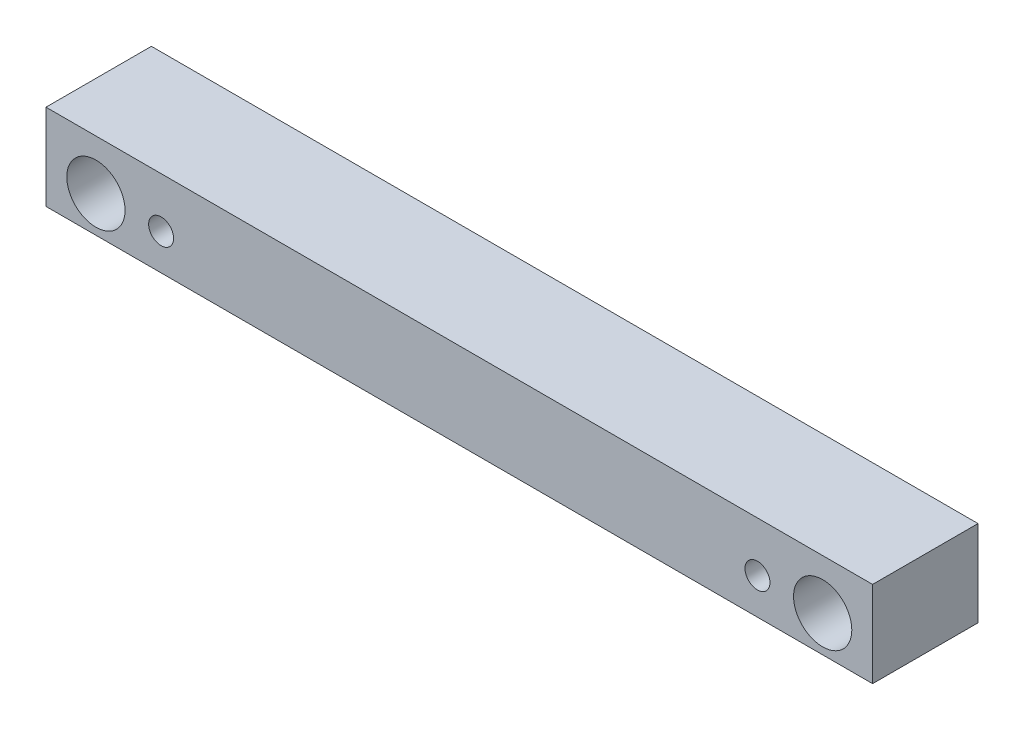
ISO-10303-21;
HEADER;
FILE_DESCRIPTION(('STEP AP214'),'2;1');
FILE_NAME('part.step','',(''),(''),'','','');
FILE_SCHEMA(('AUTOMOTIVE_DESIGN { 1 0 10303 214 1 1 1 1 }'));
ENDSEC;
DATA;
#1=APPLICATION_CONTEXT('core data for automotive mechanical design processes');
#2=APPLICATION_PROTOCOL_DEFINITION('international standard','automotive_design',2000,#1);
#3=PRODUCT_CONTEXT('',#1,'mechanical');
#4=PRODUCT('Part','Part','',(#3));
#5=PRODUCT_RELATED_PRODUCT_CATEGORY('part','',(#4));
#6=PRODUCT_DEFINITION_FORMATION('','',#4);
#7=PRODUCT_DEFINITION_CONTEXT('part definition',#1,'design');
#8=PRODUCT_DEFINITION('design','',#6,#7);
#9=PRODUCT_DEFINITION_SHAPE('','',#8);
#10=(LENGTH_UNIT() NAMED_UNIT(*) SI_UNIT(.MILLI.,.METRE.));
#11=(NAMED_UNIT(*) PLANE_ANGLE_UNIT() SI_UNIT($,.RADIAN.));
#12=(NAMED_UNIT(*) SI_UNIT($,.STERADIAN.) SOLID_ANGLE_UNIT());
#13=UNCERTAINTY_MEASURE_WITH_UNIT(LENGTH_MEASURE(1.E-05),#10,'distance_accuracy_value','');
#14=(GEOMETRIC_REPRESENTATION_CONTEXT(3) GLOBAL_UNCERTAINTY_ASSIGNED_CONTEXT((#13)) GLOBAL_UNIT_ASSIGNED_CONTEXT((#10,
#11,#12)) REPRESENTATION_CONTEXT('',''));
#15=CARTESIAN_POINT('',(0.,0.,0.));
#16=DIRECTION('',(0.,0.,1.));
#17=DIRECTION('',(1.,0.,0.));
#18=AXIS2_PLACEMENT_3D('',#15,#16,#17);
#19=CARTESIAN_POINT('',(0.,0.,76.));
#20=DIRECTION('',(0.,0.,1.));
#21=DIRECTION('',(1.,0.,0.));
#22=AXIS2_PLACEMENT_3D('',#19,#20,#21);
#23=PLANE('',#22);
#24=CARTESIAN_POINT('',(215.,162.,76.));
#25=DIRECTION('',(0.,0.,1.));
#26=DIRECTION('',(1.,0.,0.));
#27=AXIS2_PLACEMENT_3D('',#24,#25,#26);
#28=CIRCLE('',#27,9.00000000000001);
#29=CARTESIAN_POINT('',(224.,162.,76.));
#30=VERTEX_POINT('',#29);
#31=EDGE_CURVE('E123',#30,#30,#28,.T.);
#32=ORIENTED_EDGE('',*,*,#31,.F.);
#33=EDGE_LOOP('',(#32));
#34=FACE_BOUND('',#33,.T.);
#35=CARTESIAN_POINT('',(-262.,162.,76.));
#36=DIRECTION('',(0.,0.,1.));
#37=DIRECTION('',(1.,0.,0.));
#38=AXIS2_PLACEMENT_3D('',#35,#36,#37);
#39=CIRCLE('',#38,21.);
#40=CARTESIAN_POINT('',(-241.,162.,76.));
#41=VERTEX_POINT('',#40);
#42=EDGE_CURVE('E120',#41,#41,#39,.T.);
#43=ORIENTED_EDGE('',*,*,#42,.F.);
#44=EDGE_LOOP('',(#43));
#45=FACE_BOUND('',#44,.T.);
#46=CARTESIAN_POINT('',(262.,162.,76.));
#47=DIRECTION('',(0.,0.,1.));
#48=DIRECTION('',(1.,0.,0.));
#49=AXIS2_PLACEMENT_3D('',#46,#47,#48);
#50=CIRCLE('',#49,21.);
#51=CARTESIAN_POINT('',(283.,162.,76.));
#52=VERTEX_POINT('',#51);
#53=EDGE_CURVE('E114',#52,#52,#50,.T.);
#54=ORIENTED_EDGE('',*,*,#53,.F.);
#55=EDGE_LOOP('',(#54));
#56=FACE_BOUND('',#55,.T.);
#57=DIRECTION('',(-1.,0.,0.));
#58=VECTOR('',#57,1.);
#59=CARTESIAN_POINT('',(298.,198.,76.));
#60=LINE('',#59,#58);
#61=CARTESIAN_POINT('',(298.,198.,76.));
#62=VERTEX_POINT('',#61);
#63=CARTESIAN_POINT('',(-298.,198.,76.));
#64=VERTEX_POINT('',#63);
#65=EDGE_CURVE('E87',#62,#64,#60,.T.);
#66=ORIENTED_EDGE('',*,*,#65,.T.);
#67=DIRECTION('',(0.,-1.,0.));
#68=VECTOR('',#67,1.);
#69=CARTESIAN_POINT('',(-298.,198.,76.));
#70=LINE('',#69,#68);
#71=CARTESIAN_POINT('',(-298.,136.,76.));
#72=VERTEX_POINT('',#71);
#73=EDGE_CURVE('E82',#64,#72,#70,.T.);
#74=ORIENTED_EDGE('',*,*,#73,.T.);
#75=DIRECTION('',(1.,0.,0.));
#76=VECTOR('',#75,1.);
#77=CARTESIAN_POINT('',(-298.,136.,76.));
#78=LINE('',#77,#76);
#79=CARTESIAN_POINT('',(298.,136.,76.));
#80=VERTEX_POINT('',#79);
#81=EDGE_CURVE('E85',#72,#80,#78,.T.);
#82=ORIENTED_EDGE('',*,*,#81,.T.);
#83=DIRECTION('',(0.,1.,0.));
#84=VECTOR('',#83,1.);
#85=CARTESIAN_POINT('',(298.,136.,76.));
#86=LINE('',#85,#84);
#87=EDGE_CURVE('E52',#80,#62,#86,.T.);
#88=ORIENTED_EDGE('',*,*,#87,.T.);
#89=EDGE_LOOP('',(#66,#74,#82,#88));
#90=FACE_BOUND('',#89,.T.);
#91=CARTESIAN_POINT('',(-215.,162.,76.));
#92=DIRECTION('',(0.,0.,1.));
#93=DIRECTION('',(1.,0.,0.));
#94=AXIS2_PLACEMENT_3D('',#91,#92,#93);
#95=CIRCLE('',#94,9.00000000000001);
#96=CARTESIAN_POINT('',(-206.,162.,76.));
#97=VERTEX_POINT('',#96);
#98=EDGE_CURVE('E131',#97,#97,#95,.T.);
#99=ORIENTED_EDGE('',*,*,#98,.F.);
#100=EDGE_LOOP('',(#99));
#101=FACE_BOUND('',#100,.T.);
#102=ADVANCED_FACE('F35',(#34,#45,#56,#90,#101),#23,.T.);
#103=CARTESIAN_POINT('',(0.,0.,0.));
#104=DIRECTION('',(0.,0.,1.));
#105=DIRECTION('',(1.,0.,0.));
#106=AXIS2_PLACEMENT_3D('',#103,#104,#105);
#107=PLANE('',#106);
#108=CARTESIAN_POINT('',(215.,162.,0.));
#109=DIRECTION('',(0.,0.,1.));
#110=DIRECTION('',(1.,0.,0.));
#111=AXIS2_PLACEMENT_3D('',#108,#109,#110);
#112=CIRCLE('',#111,9.00000000000001);
#113=CARTESIAN_POINT('',(224.,162.,0.));
#114=VERTEX_POINT('',#113);
#115=EDGE_CURVE('E128',#114,#114,#112,.T.);
#116=ORIENTED_EDGE('',*,*,#115,.T.);
#117=EDGE_LOOP('',(#116));
#118=FACE_BOUND('',#117,.T.);
#119=CARTESIAN_POINT('',(-262.,162.,0.));
#120=DIRECTION('',(0.,0.,1.));
#121=DIRECTION('',(1.,0.,0.));
#122=AXIS2_PLACEMENT_3D('',#119,#120,#121);
#123=CIRCLE('',#122,21.);
#124=CARTESIAN_POINT('',(-241.,162.,0.));
#125=VERTEX_POINT('',#124);
#126=EDGE_CURVE('E117',#125,#125,#123,.T.);
#127=ORIENTED_EDGE('',*,*,#126,.T.);
#128=EDGE_LOOP('',(#127));
#129=FACE_BOUND('',#128,.T.);
#130=CARTESIAN_POINT('',(262.,162.,0.));
#131=DIRECTION('',(0.,0.,1.));
#132=DIRECTION('',(1.,0.,0.));
#133=AXIS2_PLACEMENT_3D('',#130,#131,#132);
#134=CIRCLE('',#133,21.);
#135=CARTESIAN_POINT('',(283.,162.,0.));
#136=VERTEX_POINT('',#135);
#137=EDGE_CURVE('E102',#136,#136,#134,.T.);
#138=ORIENTED_EDGE('',*,*,#137,.T.);
#139=EDGE_LOOP('',(#138));
#140=FACE_BOUND('',#139,.T.);
#141=DIRECTION('',(-1.,0.,0.));
#142=VECTOR('',#141,1.);
#143=CARTESIAN_POINT('',(298.,198.,0.));
#144=LINE('',#143,#142);
#145=CARTESIAN_POINT('',(298.,198.,0.));
#146=VERTEX_POINT('',#145);
#147=CARTESIAN_POINT('',(-298.,198.,0.));
#148=VERTEX_POINT('',#147);
#149=EDGE_CURVE('E99',#146,#148,#144,.T.);
#150=ORIENTED_EDGE('',*,*,#149,.F.);
#151=DIRECTION('',(0.,1.,0.));
#152=VECTOR('',#151,1.);
#153=CARTESIAN_POINT('',(298.,136.,0.));
#154=LINE('',#153,#152);
#155=CARTESIAN_POINT('',(298.,136.,0.));
#156=VERTEX_POINT('',#155);
#157=EDGE_CURVE('E75',#156,#146,#154,.T.);
#158=ORIENTED_EDGE('',*,*,#157,.F.);
#159=DIRECTION('',(1.,0.,0.));
#160=VECTOR('',#159,1.);
#161=CARTESIAN_POINT('',(-298.,136.,0.));
#162=LINE('',#161,#160);
#163=CARTESIAN_POINT('',(-298.,136.,0.));
#164=VERTEX_POINT('',#163);
#165=EDGE_CURVE('E69',#164,#156,#162,.T.);
#166=ORIENTED_EDGE('',*,*,#165,.F.);
#167=DIRECTION('',(0.,-1.,0.));
#168=VECTOR('',#167,1.);
#169=CARTESIAN_POINT('',(-298.,198.,0.));
#170=LINE('',#169,#168);
#171=EDGE_CURVE('E91',#148,#164,#170,.T.);
#172=ORIENTED_EDGE('',*,*,#171,.F.);
#173=EDGE_LOOP('',(#150,#158,#166,#172));
#174=FACE_BOUND('',#173,.T.);
#175=CARTESIAN_POINT('',(-215.,162.,0.));
#176=DIRECTION('',(0.,0.,1.));
#177=DIRECTION('',(1.,0.,0.));
#178=AXIS2_PLACEMENT_3D('',#175,#176,#177);
#179=CIRCLE('',#178,9.00000000000001);
#180=CARTESIAN_POINT('',(-206.,162.,0.));
#181=VERTEX_POINT('',#180);
#182=EDGE_CURVE('E134',#181,#181,#179,.T.);
#183=ORIENTED_EDGE('',*,*,#182,.T.);
#184=EDGE_LOOP('',(#183));
#185=FACE_BOUND('',#184,.T.);
#186=ADVANCED_FACE('F110',(#118,#129,#140,#174,#185),#107,.F.);
#187=CARTESIAN_POINT('',(298.,198.,76.));
#188=DIRECTION('',(0.,-1.,0.));
#189=DIRECTION('',(0.,0.,-1.));
#190=AXIS2_PLACEMENT_3D('',#187,#188,#189);
#191=PLANE('',#190);
#192=ORIENTED_EDGE('',*,*,#149,.T.);
#193=DIRECTION('',(0.,0.,-1.));
#194=VECTOR('',#193,1.);
#195=CARTESIAN_POINT('',(-298.,198.,76.));
#196=LINE('',#195,#194);
#197=EDGE_CURVE('E11',#64,#148,#196,.T.);
#198=ORIENTED_EDGE('',*,*,#197,.F.);
#199=ORIENTED_EDGE('',*,*,#65,.F.);
#200=DIRECTION('',(0.,0.,-1.));
#201=VECTOR('',#200,1.);
#202=CARTESIAN_POINT('',(298.,198.,76.));
#203=LINE('',#202,#201);
#204=EDGE_CURVE('E95',#62,#146,#203,.T.);
#205=ORIENTED_EDGE('',*,*,#204,.T.);
#206=EDGE_LOOP('',(#192,#198,#199,#205));
#207=FACE_BOUND('',#206,.T.);
#208=ADVANCED_FACE('F37',(#207),#191,.F.);
#209=CARTESIAN_POINT('',(-298.,198.,76.));
#210=DIRECTION('',(1.,0.,0.));
#211=DIRECTION('',(0.,0.,-1.));
#212=AXIS2_PLACEMENT_3D('',#209,#210,#211);
#213=PLANE('',#212);
#214=ORIENTED_EDGE('',*,*,#171,.T.);
#215=DIRECTION('',(0.,0.,-1.));
#216=VECTOR('',#215,1.);
#217=CARTESIAN_POINT('',(-298.,136.,76.));
#218=LINE('',#217,#216);
#219=EDGE_CURVE('E44',#72,#164,#218,.T.);
#220=ORIENTED_EDGE('',*,*,#219,.F.);
#221=ORIENTED_EDGE('',*,*,#73,.F.);
#222=ORIENTED_EDGE('',*,*,#197,.T.);
#223=EDGE_LOOP('',(#214,#220,#221,#222));
#224=FACE_BOUND('',#223,.T.);
#225=ADVANCED_FACE('F90',(#224),#213,.F.);
#226=CARTESIAN_POINT('',(-298.,136.,76.));
#227=DIRECTION('',(0.,1.,0.));
#228=DIRECTION('',(0.,0.,1.));
#229=AXIS2_PLACEMENT_3D('',#226,#227,#228);
#230=PLANE('',#229);
#231=ORIENTED_EDGE('',*,*,#165,.T.);
#232=DIRECTION('',(0.,0.,-1.));
#233=VECTOR('',#232,1.);
#234=CARTESIAN_POINT('',(298.,136.,76.));
#235=LINE('',#234,#233);
#236=EDGE_CURVE('E92',#80,#156,#235,.T.);
#237=ORIENTED_EDGE('',*,*,#236,.F.);
#238=ORIENTED_EDGE('',*,*,#81,.F.);
#239=ORIENTED_EDGE('',*,*,#219,.T.);
#240=EDGE_LOOP('',(#231,#237,#238,#239));
#241=FACE_BOUND('',#240,.T.);
#242=ADVANCED_FACE('F93',(#241),#230,.F.);
#243=CARTESIAN_POINT('',(298.,136.,76.));
#244=DIRECTION('',(-1.,0.,0.));
#245=DIRECTION('',(0.,0.,1.));
#246=AXIS2_PLACEMENT_3D('',#243,#244,#245);
#247=PLANE('',#246);
#248=ORIENTED_EDGE('',*,*,#157,.T.);
#249=ORIENTED_EDGE('',*,*,#204,.F.);
#250=ORIENTED_EDGE('',*,*,#87,.F.);
#251=ORIENTED_EDGE('',*,*,#236,.T.);
#252=EDGE_LOOP('',(#248,#249,#250,#251));
#253=FACE_BOUND('',#252,.T.);
#254=ADVANCED_FACE('F107',(#253),#247,.F.);
#255=CARTESIAN_POINT('',(262.,162.,0.));
#256=DIRECTION('',(0.,0.,1.));
#257=DIRECTION('',(1.,0.,0.));
#258=AXIS2_PLACEMENT_3D('',#255,#256,#257);
#259=CYLINDRICAL_SURFACE('',#258,21.);
#260=ORIENTED_EDGE('',*,*,#137,.F.);
#261=EDGE_LOOP('',(#260));
#262=FACE_BOUND('',#261,.T.);
#263=ORIENTED_EDGE('',*,*,#53,.T.);
#264=EDGE_LOOP('',(#263));
#265=FACE_BOUND('',#264,.T.);
#266=ADVANCED_FACE('F160',(#262,#265),#259,.F.);
#267=CARTESIAN_POINT('',(-262.,162.,0.));
#268=DIRECTION('',(0.,0.,1.));
#269=DIRECTION('',(1.,0.,0.));
#270=AXIS2_PLACEMENT_3D('',#267,#268,#269);
#271=CYLINDRICAL_SURFACE('',#270,21.);
#272=ORIENTED_EDGE('',*,*,#126,.F.);
#273=EDGE_LOOP('',(#272));
#274=FACE_BOUND('',#273,.T.);
#275=ORIENTED_EDGE('',*,*,#42,.T.);
#276=EDGE_LOOP('',(#275));
#277=FACE_BOUND('',#276,.T.);
#278=ADVANCED_FACE('F146',(#274,#277),#271,.F.);
#279=CARTESIAN_POINT('',(215.,162.,0.));
#280=DIRECTION('',(0.,0.,1.));
#281=DIRECTION('',(1.,0.,0.));
#282=AXIS2_PLACEMENT_3D('',#279,#280,#281);
#283=CYLINDRICAL_SURFACE('',#282,9.00000000000001);
#284=ORIENTED_EDGE('',*,*,#31,.T.);
#285=EDGE_LOOP('',(#284));
#286=FACE_BOUND('',#285,.T.);
#287=ORIENTED_EDGE('',*,*,#115,.F.);
#288=EDGE_LOOP('',(#287));
#289=FACE_BOUND('',#288,.T.);
#290=ADVANCED_FACE('F140',(#286,#289),#283,.F.);
#291=CARTESIAN_POINT('',(-215.,162.,0.));
#292=DIRECTION('',(0.,0.,1.));
#293=DIRECTION('',(1.,0.,0.));
#294=AXIS2_PLACEMENT_3D('',#291,#292,#293);
#295=CYLINDRICAL_SURFACE('',#294,9.00000000000001);
#296=ORIENTED_EDGE('',*,*,#98,.T.);
#297=EDGE_LOOP('',(#296));
#298=FACE_BOUND('',#297,.T.);
#299=ORIENTED_EDGE('',*,*,#182,.F.);
#300=EDGE_LOOP('',(#299));
#301=FACE_BOUND('',#300,.T.);
#302=ADVANCED_FACE('F138',(#298,#301),#295,.F.);
#303=CLOSED_SHELL('',(#102,#186,#208,#225,#242,#254,#266,#278,#290,#302));
#304=MANIFOLD_SOLID_BREP('B2',#303);
#305=ADVANCED_BREP_SHAPE_REPRESENTATION('',(#18,#304),#14);
#306=SHAPE_DEFINITION_REPRESENTATION(#9,#305);
ENDSEC;
END-ISO-10303-21;
